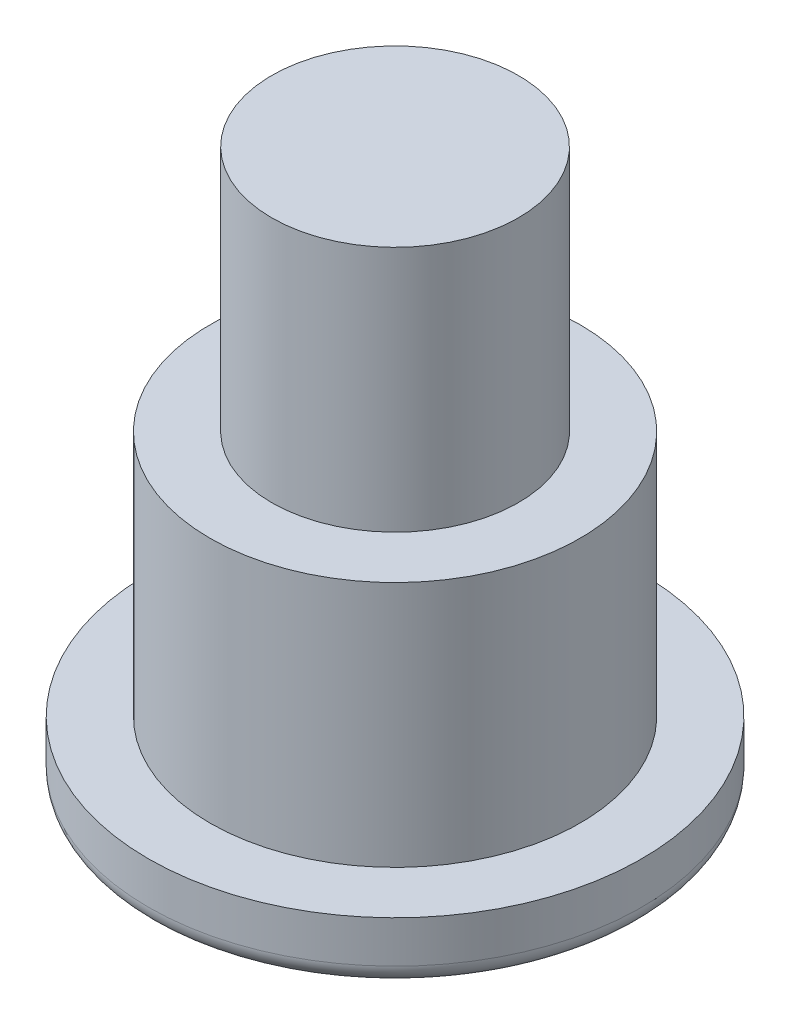
ISO-10303-21;
HEADER;
FILE_DESCRIPTION(('STEP AP214'),'2;1');
FILE_NAME('part.step','',(''),(''),'','','');
FILE_SCHEMA(('AUTOMOTIVE_DESIGN { 1 0 10303 214 1 1 1 1 }'));
ENDSEC;
DATA;
#1=APPLICATION_CONTEXT('core data for automotive mechanical design processes');
#2=APPLICATION_PROTOCOL_DEFINITION('international standard','automotive_design',2000,#1);
#3=PRODUCT_CONTEXT('',#1,'mechanical');
#4=PRODUCT('Part','Part','',(#3));
#5=PRODUCT_RELATED_PRODUCT_CATEGORY('part','',(#4));
#6=PRODUCT_DEFINITION_FORMATION('','',#4);
#7=PRODUCT_DEFINITION_CONTEXT('part definition',#1,'design');
#8=PRODUCT_DEFINITION('design','',#6,#7);
#9=PRODUCT_DEFINITION_SHAPE('','',#8);
#10=(LENGTH_UNIT() NAMED_UNIT(*) SI_UNIT(.MILLI.,.METRE.));
#11=(NAMED_UNIT(*) PLANE_ANGLE_UNIT() SI_UNIT($,.RADIAN.));
#12=(NAMED_UNIT(*) SI_UNIT($,.STERADIAN.) SOLID_ANGLE_UNIT());
#13=UNCERTAINTY_MEASURE_WITH_UNIT(LENGTH_MEASURE(1.E-05),#10,'distance_accuracy_value','');
#14=(GEOMETRIC_REPRESENTATION_CONTEXT(3) GLOBAL_UNCERTAINTY_ASSIGNED_CONTEXT((#13)) GLOBAL_UNIT_ASSIGNED_CONTEXT((#10,
#11,#12)) REPRESENTATION_CONTEXT('',''));
#15=CARTESIAN_POINT('',(0.,0.,0.));
#16=DIRECTION('',(0.,0.,1.));
#17=DIRECTION('',(1.,0.,0.));
#18=AXIS2_PLACEMENT_3D('',#15,#16,#17);
#19=CARTESIAN_POINT('',(0.,0.79375,0.));
#20=DIRECTION('',(0.,-1.,0.));
#21=DIRECTION('',(0.,0.,-1.));
#22=AXIS2_PLACEMENT_3D('',#19,#20,#21);
#23=CYLINDRICAL_SURFACE('',#22,3.175);
#24=CARTESIAN_POINT('',(0.,0.254,0.));
#25=DIRECTION('',(0.,1.,0.));
#26=DIRECTION('',(0.,0.,1.));
#27=AXIS2_PLACEMENT_3D('',#24,#25,#26);
#28=CIRCLE('',#27,3.175);
#29=CARTESIAN_POINT('',(0.,0.254,3.175));
#30=VERTEX_POINT('',#29);
#31=EDGE_CURVE('E58',#30,#30,#28,.T.);
#32=ORIENTED_EDGE('',*,*,#31,.T.);
#33=EDGE_LOOP('',(#32));
#34=FACE_BOUND('',#33,.T.);
#35=CARTESIAN_POINT('',(0.,0.79375,0.));
#36=DIRECTION('',(0.,1.,0.));
#37=DIRECTION('',(0.,0.,1.));
#38=AXIS2_PLACEMENT_3D('',#35,#36,#37);
#39=CIRCLE('',#38,3.175);
#40=CARTESIAN_POINT('',(0.,0.79375,3.175));
#41=VERTEX_POINT('',#40);
#42=EDGE_CURVE('E71',#41,#41,#39,.T.);
#43=ORIENTED_EDGE('',*,*,#42,.F.);
#44=EDGE_LOOP('',(#43));
#45=FACE_BOUND('',#44,.T.);
#46=ADVANCED_FACE('F50',(#34,#45),#23,.T.);
#47=CARTESIAN_POINT('',(0.,0.79375,0.));
#48=DIRECTION('',(0.,1.,0.));
#49=DIRECTION('',(0.,0.,1.));
#50=AXIS2_PLACEMENT_3D('',#47,#48,#49);
#51=PLANE('',#50);
#52=CARTESIAN_POINT('',(0.,0.79375,0.));
#53=DIRECTION('',(0.,1.,0.));
#54=DIRECTION('',(0.,0.,1.));
#55=AXIS2_PLACEMENT_3D('',#52,#53,#54);
#56=CIRCLE('',#55,2.38125);
#57=CARTESIAN_POINT('',(0.,0.79375,2.38125));
#58=VERTEX_POINT('',#57);
#59=EDGE_CURVE('E68',#58,#58,#56,.T.);
#60=ORIENTED_EDGE('',*,*,#59,.F.);
#61=EDGE_LOOP('',(#60));
#62=FACE_BOUND('',#61,.T.);
#63=ORIENTED_EDGE('',*,*,#42,.T.);
#64=EDGE_LOOP('',(#63));
#65=FACE_BOUND('',#64,.T.);
#66=ADVANCED_FACE('F108',(#62,#65),#51,.T.);
#67=CARTESIAN_POINT('',(0.,0.,0.));
#68=DIRECTION('',(0.,1.,0.));
#69=DIRECTION('',(0.,0.,1.));
#70=AXIS2_PLACEMENT_3D('',#67,#68,#69);
#71=PLANE('',#70);
#72=CARTESIAN_POINT('',(0.,0.,0.));
#73=DIRECTION('',(0.,1.,0.));
#74=DIRECTION('',(0.,0.,1.));
#75=AXIS2_PLACEMENT_3D('',#72,#73,#74);
#76=CIRCLE('',#75,2.921);
#77=CARTESIAN_POINT('',(0.,0.,2.921));
#78=VERTEX_POINT('',#77);
#79=EDGE_CURVE('E12',#78,#78,#76,.F.);
#80=ORIENTED_EDGE('',*,*,#79,.T.);
#81=EDGE_LOOP('',(#80));
#82=FACE_BOUND('',#81,.T.);
#83=ADVANCED_FACE('F104',(#82),#71,.F.);
#84=CARTESIAN_POINT('',(0.,3.96875,0.));
#85=DIRECTION('',(0.,-1.,0.));
#86=DIRECTION('',(0.,0.,-1.));
#87=AXIS2_PLACEMENT_3D('',#84,#85,#86);
#88=CYLINDRICAL_SURFACE('',#87,2.38125);
#89=CARTESIAN_POINT('',(0.,3.96875,0.));
#90=DIRECTION('',(0.,1.,0.));
#91=DIRECTION('',(0.,0.,1.));
#92=AXIS2_PLACEMENT_3D('',#89,#90,#91);
#93=CIRCLE('',#92,2.38125);
#94=CARTESIAN_POINT('',(0.,3.96875,2.38125));
#95=VERTEX_POINT('',#94);
#96=EDGE_CURVE('E75',#95,#95,#93,.T.);
#97=ORIENTED_EDGE('',*,*,#96,.F.);
#98=EDGE_LOOP('',(#97));
#99=FACE_BOUND('',#98,.T.);
#100=ORIENTED_EDGE('',*,*,#59,.T.);
#101=EDGE_LOOP('',(#100));
#102=FACE_BOUND('',#101,.T.);
#103=ADVANCED_FACE('F98',(#99,#102),#88,.T.);
#104=CARTESIAN_POINT('',(0.,3.96875,0.));
#105=DIRECTION('',(0.,1.,0.));
#106=DIRECTION('',(0.,0.,1.));
#107=AXIS2_PLACEMENT_3D('',#104,#105,#106);
#108=PLANE('',#107);
#109=CARTESIAN_POINT('',(0.,3.96875,0.));
#110=DIRECTION('',(0.,1.,0.));
#111=DIRECTION('',(0.,0.,1.));
#112=AXIS2_PLACEMENT_3D('',#109,#110,#111);
#113=CIRCLE('',#112,1.5875);
#114=CARTESIAN_POINT('',(0.,3.96875,1.5875));
#115=VERTEX_POINT('',#114);
#116=EDGE_CURVE('E63',#115,#115,#113,.T.);
#117=ORIENTED_EDGE('',*,*,#116,.F.);
#118=EDGE_LOOP('',(#117));
#119=FACE_BOUND('',#118,.T.);
#120=ORIENTED_EDGE('',*,*,#96,.T.);
#121=EDGE_LOOP('',(#120));
#122=FACE_BOUND('',#121,.T.);
#123=ADVANCED_FACE('F92',(#119,#122),#108,.T.);
#124=CARTESIAN_POINT('',(0.,7.14375,0.));
#125=DIRECTION('',(0.,-1.,0.));
#126=DIRECTION('',(0.,0.,-1.));
#127=AXIS2_PLACEMENT_3D('',#124,#125,#126);
#128=CYLINDRICAL_SURFACE('',#127,1.5875);
#129=CARTESIAN_POINT('',(0.,7.14375,0.));
#130=DIRECTION('',(0.,1.,0.));
#131=DIRECTION('',(0.,0.,1.));
#132=AXIS2_PLACEMENT_3D('',#129,#130,#131);
#133=CIRCLE('',#132,1.5875);
#134=CARTESIAN_POINT('',(0.,7.14375,1.5875));
#135=VERTEX_POINT('',#134);
#136=EDGE_CURVE('E81',#135,#135,#133,.T.);
#137=ORIENTED_EDGE('',*,*,#136,.F.);
#138=EDGE_LOOP('',(#137));
#139=FACE_BOUND('',#138,.T.);
#140=ORIENTED_EDGE('',*,*,#116,.T.);
#141=EDGE_LOOP('',(#140));
#142=FACE_BOUND('',#141,.T.);
#143=ADVANCED_FACE('F89',(#139,#142),#128,.T.);
#144=CARTESIAN_POINT('',(0.,7.14375,0.));
#145=DIRECTION('',(0.,1.,0.));
#146=DIRECTION('',(0.,0.,1.));
#147=AXIS2_PLACEMENT_3D('',#144,#145,#146);
#148=PLANE('',#147);
#149=ORIENTED_EDGE('',*,*,#136,.T.);
#150=EDGE_LOOP('',(#149));
#151=FACE_BOUND('',#150,.T.);
#152=ADVANCED_FACE('F87',(#151),#148,.T.);
#153=CARTESIAN_POINT('',(0.,0.254,0.));
#154=DIRECTION('',(0.,1.,0.));
#155=DIRECTION('',(0.,0.,1.));
#156=AXIS2_PLACEMENT_3D('',#153,#154,#155);
#157=TOROIDAL_SURFACE('',#156,2.921,0.254);
#158=ORIENTED_EDGE('',*,*,#79,.F.);
#159=EDGE_LOOP('',(#158));
#160=FACE_BOUND('',#159,.T.);
#161=ORIENTED_EDGE('',*,*,#31,.F.);
#162=EDGE_LOOP('',(#161));
#163=FACE_BOUND('',#162,.T.);
#164=ADVANCED_FACE('F52',(#160,#163),#157,.T.);
#165=CLOSED_SHELL('',(#46,#66,#83,#103,#123,#143,#152,#164));
#166=MANIFOLD_SOLID_BREP('B2',#165);
#167=ADVANCED_BREP_SHAPE_REPRESENTATION('',(#18,#166),#14);
#168=SHAPE_DEFINITION_REPRESENTATION(#9,#167);
ENDSEC;
END-ISO-10303-21;
